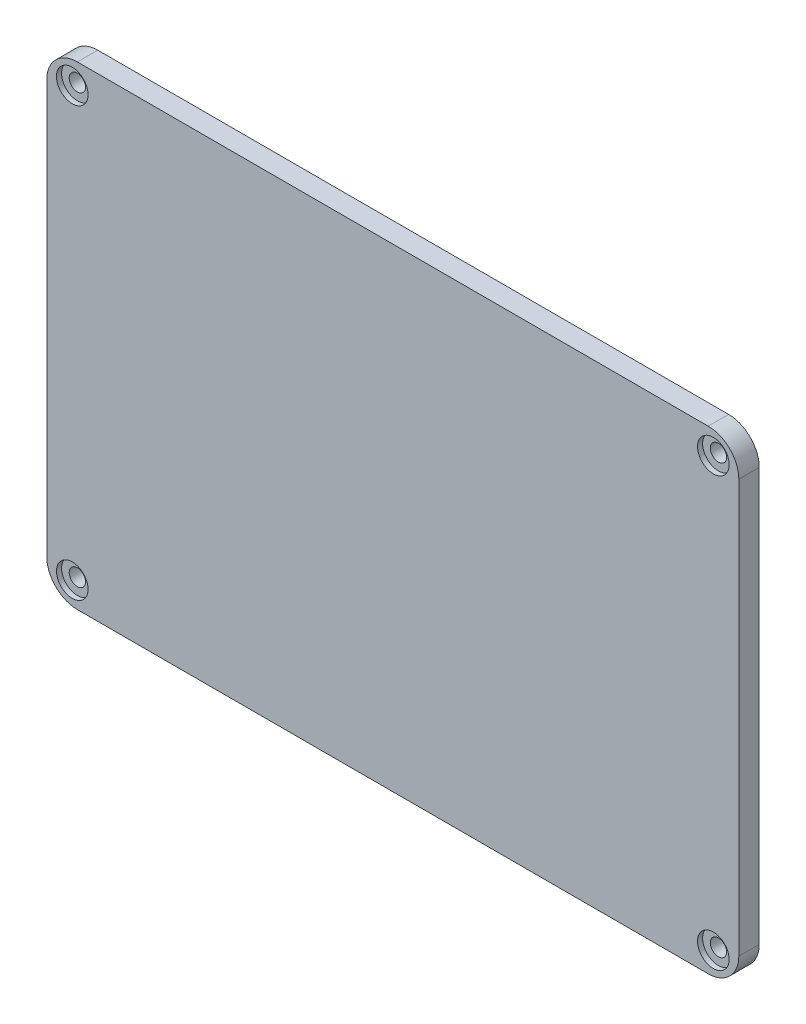
ISO-10303-21;
HEADER;
FILE_DESCRIPTION(('STEP AP214'),'2;1');
FILE_NAME('part.step','',(''),(''),'','','');
FILE_SCHEMA(('AUTOMOTIVE_DESIGN { 1 0 10303 214 1 1 1 1 }'));
ENDSEC;
DATA;
#1=APPLICATION_CONTEXT('core data for automotive mechanical design processes');
#2=APPLICATION_PROTOCOL_DEFINITION('international standard','automotive_design',2000,#1);
#3=PRODUCT_CONTEXT('',#1,'mechanical');
#4=PRODUCT('Part','Part','',(#3));
#5=PRODUCT_RELATED_PRODUCT_CATEGORY('part','',(#4));
#6=PRODUCT_DEFINITION_FORMATION('','',#4);
#7=PRODUCT_DEFINITION_CONTEXT('part definition',#1,'design');
#8=PRODUCT_DEFINITION('design','',#6,#7);
#9=PRODUCT_DEFINITION_SHAPE('','',#8);
#10=(LENGTH_UNIT() NAMED_UNIT(*) SI_UNIT(.MILLI.,.METRE.));
#11=(NAMED_UNIT(*) PLANE_ANGLE_UNIT() SI_UNIT($,.RADIAN.));
#12=(NAMED_UNIT(*) SI_UNIT($,.STERADIAN.) SOLID_ANGLE_UNIT());
#13=UNCERTAINTY_MEASURE_WITH_UNIT(LENGTH_MEASURE(1.E-05),#10,'distance_accuracy_value','');
#14=(GEOMETRIC_REPRESENTATION_CONTEXT(3) GLOBAL_UNCERTAINTY_ASSIGNED_CONTEXT((#13)) GLOBAL_UNIT_ASSIGNED_CONTEXT((#10,
#11,#12)) REPRESENTATION_CONTEXT('',''));
#15=CARTESIAN_POINT('',(0.,0.,0.));
#16=DIRECTION('',(0.,0.,1.));
#17=DIRECTION('',(1.,0.,0.));
#18=AXIS2_PLACEMENT_3D('',#15,#16,#17);
#19=CARTESIAN_POINT('',(-7.20437517782034,-58.6101542455461,4.));
#20=DIRECTION('',(0.,0.,-1.));
#21=DIRECTION('',(-1.,0.,0.));
#22=AXIS2_PLACEMENT_3D('',#19,#20,#21);
#23=CYLINDRICAL_SURFACE('',#22,1.59999999999999);
#24=CARTESIAN_POINT('',(-7.20437517782034,-58.6101542455461,0.));
#25=DIRECTION('',(0.,0.,1.));
#26=DIRECTION('',(1.,0.,0.));
#27=AXIS2_PLACEMENT_3D('',#24,#25,#26);
#28=CIRCLE('',#27,1.59999999999999);
#29=CARTESIAN_POINT('',(-5.60437517782034,-58.6101542455461,0.));
#30=VERTEX_POINT('',#29);
#31=EDGE_CURVE('E136',#30,#30,#28,.T.);
#32=ORIENTED_EDGE('',*,*,#31,.F.);
#33=EDGE_LOOP('',(#32));
#34=FACE_BOUND('',#33,.T.);
#35=CARTESIAN_POINT('',(-7.20437517782034,-58.6101542455461,3.));
#36=DIRECTION('',(0.,0.,1.));
#37=DIRECTION('',(1.,0.,0.));
#38=AXIS2_PLACEMENT_3D('',#35,#36,#37);
#39=CIRCLE('',#38,1.59999999999999);
#40=CARTESIAN_POINT('',(-5.60437517782034,-58.6101542455461,3.));
#41=VERTEX_POINT('',#40);
#42=EDGE_CURVE('E37',#41,#41,#39,.T.);
#43=ORIENTED_EDGE('',*,*,#42,.T.);
#44=EDGE_LOOP('',(#43));
#45=FACE_BOUND('',#44,.T.);
#46=ADVANCED_FACE('F33',(#34,#45),#23,.F.);
#47=CARTESIAN_POINT('',(118.49562482218,-142.610154245546,4.));
#48=DIRECTION('',(0.,0.,-1.));
#49=DIRECTION('',(-1.,0.,0.));
#50=AXIS2_PLACEMENT_3D('',#47,#48,#49);
#51=CYLINDRICAL_SURFACE('',#50,1.6);
#52=CARTESIAN_POINT('',(118.49562482218,-142.610154245546,0.));
#53=DIRECTION('',(0.,0.,1.));
#54=DIRECTION('',(1.,0.,0.));
#55=AXIS2_PLACEMENT_3D('',#52,#53,#54);
#56=CIRCLE('',#55,1.6);
#57=CARTESIAN_POINT('',(120.09562482218,-142.610154245546,0.));
#58=VERTEX_POINT('',#57);
#59=EDGE_CURVE('E174',#58,#58,#56,.T.);
#60=ORIENTED_EDGE('',*,*,#59,.F.);
#61=EDGE_LOOP('',(#60));
#62=FACE_BOUND('',#61,.T.);
#63=CARTESIAN_POINT('',(118.49562482218,-142.610154245546,3.));
#64=DIRECTION('',(0.,0.,1.));
#65=DIRECTION('',(1.,0.,0.));
#66=AXIS2_PLACEMENT_3D('',#63,#64,#65);
#67=CIRCLE('',#66,1.6);
#68=CARTESIAN_POINT('',(120.09562482218,-142.610154245546,3.));
#69=VERTEX_POINT('',#68);
#70=EDGE_CURVE('E162',#69,#69,#67,.T.);
#71=ORIENTED_EDGE('',*,*,#70,.T.);
#72=EDGE_LOOP('',(#71));
#73=FACE_BOUND('',#72,.T.);
#74=ADVANCED_FACE('F226',(#62,#73),#51,.F.);
#75=CARTESIAN_POINT('',(-6.20437517782034,-60.1101542455461,4.));
#76=DIRECTION('',(0.,0.,1.));
#77=DIRECTION('',(1.,0.,0.));
#78=AXIS2_PLACEMENT_3D('',#75,#76,#77);
#79=PLANE('',#78);
#80=CARTESIAN_POINT('',(-7.20437517782034,-142.610154245546,4.));
#81=DIRECTION('',(0.,0.,1.));
#82=DIRECTION('',(-1.,0.,0.));
#83=AXIS2_PLACEMENT_3D('',#80,#81,#82);
#84=CIRCLE('',#83,3.1);
#85=CARTESIAN_POINT('',(-10.3043751778203,-142.610154245546,4.));
#86=VERTEX_POINT('',#85);
#87=EDGE_CURVE('E391',#86,#86,#84,.T.);
#88=ORIENTED_EDGE('',*,*,#87,.F.);
#89=EDGE_LOOP('',(#88));
#90=FACE_BOUND('',#89,.T.);
#91=CARTESIAN_POINT('',(118.49562482218,-142.610154245546,4.));
#92=DIRECTION('',(0.,0.,1.));
#93=DIRECTION('',(1.,0.,0.));
#94=AXIS2_PLACEMENT_3D('',#91,#92,#93);
#95=CIRCLE('',#94,3.10000000000001);
#96=CARTESIAN_POINT('',(121.59562482218,-142.610154245546,4.));
#97=VERTEX_POINT('',#96);
#98=EDGE_CURVE('E397',#97,#97,#95,.T.);
#99=ORIENTED_EDGE('',*,*,#98,.F.);
#100=EDGE_LOOP('',(#99));
#101=FACE_BOUND('',#100,.T.);
#102=CARTESIAN_POINT('',(118.49562482218,-58.610154245546,4.));
#103=DIRECTION('',(0.,0.,1.));
#104=DIRECTION('',(-1.,0.,0.));
#105=AXIS2_PLACEMENT_3D('',#102,#103,#104);
#106=CIRCLE('',#105,3.10000000000002);
#107=CARTESIAN_POINT('',(115.39562482218,-58.610154245546,4.));
#108=VERTEX_POINT('',#107);
#109=EDGE_CURVE('E403',#108,#108,#106,.T.);
#110=ORIENTED_EDGE('',*,*,#109,.F.);
#111=EDGE_LOOP('',(#110));
#112=FACE_BOUND('',#111,.T.);
#113=CARTESIAN_POINT('',(-7.20437517782034,-58.6101542455461,4.));
#114=DIRECTION('',(0.,0.,1.));
#115=DIRECTION('',(1.,0.,0.));
#116=AXIS2_PLACEMENT_3D('',#113,#114,#115);
#117=CIRCLE('',#116,3.1);
#118=CARTESIAN_POINT('',(-4.10437517782034,-58.6101542455461,4.));
#119=VERTEX_POINT('',#118);
#120=EDGE_CURVE('E182',#119,#119,#117,.T.);
#121=ORIENTED_EDGE('',*,*,#120,.F.);
#122=EDGE_LOOP('',(#121));
#123=FACE_BOUND('',#122,.T.);
#124=CARTESIAN_POINT('',(-6.20437517782034,-60.1101542455461,4.));
#125=DIRECTION('',(0.,0.,1.));
#126=DIRECTION('',(1.,0.,0.));
#127=AXIS2_PLACEMENT_3D('',#124,#125,#126);
#128=CIRCLE('',#127,6.);
#129=CARTESIAN_POINT('',(-6.20437517782034,-54.1101542455461,4.));
#130=VERTEX_POINT('',#129);
#131=CARTESIAN_POINT('',(-12.2043751778203,-60.1101542455461,4.));
#132=VERTEX_POINT('',#131);
#133=EDGE_CURVE('E147',#130,#132,#128,.T.);
#134=ORIENTED_EDGE('',*,*,#133,.T.);
#135=DIRECTION('',(0.,-1.,0.));
#136=VECTOR('',#135,1.);
#137=CARTESIAN_POINT('',(-12.2043751778203,-60.1101542455461,4.));
#138=LINE('',#137,#136);
#139=CARTESIAN_POINT('',(-12.2043751778203,-141.110154245546,4.));
#140=VERTEX_POINT('',#139);
#141=EDGE_CURVE('E95',#132,#140,#138,.T.);
#142=ORIENTED_EDGE('',*,*,#141,.T.);
#143=CARTESIAN_POINT('',(-6.20437517782034,-141.110154245546,4.));
#144=DIRECTION('',(0.,0.,1.));
#145=DIRECTION('',(1.,0.,0.));
#146=AXIS2_PLACEMENT_3D('',#143,#144,#145);
#147=CIRCLE('',#146,6.);
#148=CARTESIAN_POINT('',(-6.20437517782034,-147.110154245546,4.));
#149=VERTEX_POINT('',#148);
#150=EDGE_CURVE('E191',#140,#149,#147,.T.);
#151=ORIENTED_EDGE('',*,*,#150,.T.);
#152=DIRECTION('',(1.,0.,0.));
#153=VECTOR('',#152,1.);
#154=CARTESIAN_POINT('',(-6.20437517782034,-147.110154245546,4.));
#155=LINE('',#154,#153);
#156=CARTESIAN_POINT('',(117.49562482218,-147.110154245546,4.));
#157=VERTEX_POINT('',#156);
#158=EDGE_CURVE('E193',#149,#157,#155,.T.);
#159=ORIENTED_EDGE('',*,*,#158,.T.);
#160=CARTESIAN_POINT('',(117.49562482218,-141.110154245546,4.));
#161=DIRECTION('',(0.,0.,1.));
#162=DIRECTION('',(1.,0.,0.));
#163=AXIS2_PLACEMENT_3D('',#160,#161,#162);
#164=CIRCLE('',#163,6.00000000000001);
#165=CARTESIAN_POINT('',(123.49562482218,-141.110154245546,4.));
#166=VERTEX_POINT('',#165);
#167=EDGE_CURVE('E114',#157,#166,#164,.T.);
#168=ORIENTED_EDGE('',*,*,#167,.T.);
#169=DIRECTION('',(0.,1.,0.));
#170=VECTOR('',#169,1.);
#171=CARTESIAN_POINT('',(123.49562482218,-141.110154245546,4.));
#172=LINE('',#171,#170);
#173=CARTESIAN_POINT('',(123.49562482218,-60.1101542455461,4.));
#174=VERTEX_POINT('',#173);
#175=EDGE_CURVE('E108',#166,#174,#172,.T.);
#176=ORIENTED_EDGE('',*,*,#175,.T.);
#177=CARTESIAN_POINT('',(117.49562482218,-60.1101542455461,4.));
#178=DIRECTION('',(0.,0.,1.));
#179=DIRECTION('',(1.,0.,0.));
#180=AXIS2_PLACEMENT_3D('',#177,#178,#179);
#181=CIRCLE('',#180,6.00000000000001);
#182=CARTESIAN_POINT('',(117.49562482218,-54.1101542455461,4.));
#183=VERTEX_POINT('',#182);
#184=EDGE_CURVE('E112',#174,#183,#181,.T.);
#185=ORIENTED_EDGE('',*,*,#184,.T.);
#186=DIRECTION('',(-1.,0.,0.));
#187=VECTOR('',#186,1.);
#188=CARTESIAN_POINT('',(117.49562482218,-54.1101542455461,4.));
#189=LINE('',#188,#187);
#190=EDGE_CURVE('E52',#183,#130,#189,.T.);
#191=ORIENTED_EDGE('',*,*,#190,.T.);
#192=EDGE_LOOP('',(#134,#142,#151,#159,#168,#176,#185,#191));
#193=FACE_BOUND('',#192,.T.);
#194=ADVANCED_FACE('F110',(#90,#101,#112,#123,#193),#79,.T.);
#195=CARTESIAN_POINT('',(-6.20437517782034,-60.1101542455461,0.));
#196=DIRECTION('',(0.,0.,1.));
#197=DIRECTION('',(1.,0.,0.));
#198=AXIS2_PLACEMENT_3D('',#195,#196,#197);
#199=PLANE('',#198);
#200=CARTESIAN_POINT('',(-6.20437517782034,-60.1101542455461,0.));
#201=DIRECTION('',(0.,0.,1.));
#202=DIRECTION('',(1.,0.,0.));
#203=AXIS2_PLACEMENT_3D('',#200,#201,#202);
#204=CIRCLE('',#203,6.);
#205=CARTESIAN_POINT('',(-6.20437517782034,-54.1101542455461,0.));
#206=VERTEX_POINT('',#205);
#207=CARTESIAN_POINT('',(-12.2043751778203,-60.1101542455461,0.));
#208=VERTEX_POINT('',#207);
#209=EDGE_CURVE('E132',#206,#208,#204,.T.);
#210=ORIENTED_EDGE('',*,*,#209,.F.);
#211=DIRECTION('',(-1.,0.,0.));
#212=VECTOR('',#211,1.);
#213=CARTESIAN_POINT('',(117.49562482218,-54.1101542455461,0.));
#214=LINE('',#213,#212);
#215=CARTESIAN_POINT('',(117.49562482218,-54.1101542455461,0.));
#216=VERTEX_POINT('',#215);
#217=EDGE_CURVE('E87',#216,#206,#214,.T.);
#218=ORIENTED_EDGE('',*,*,#217,.F.);
#219=CARTESIAN_POINT('',(117.49562482218,-60.1101542455461,0.));
#220=DIRECTION('',(0.,0.,1.));
#221=DIRECTION('',(1.,0.,0.));
#222=AXIS2_PLACEMENT_3D('',#219,#220,#221);
#223=CIRCLE('',#222,6.00000000000001);
#224=CARTESIAN_POINT('',(123.49562482218,-60.1101542455461,0.));
#225=VERTEX_POINT('',#224);
#226=EDGE_CURVE('E81',#225,#216,#223,.T.);
#227=ORIENTED_EDGE('',*,*,#226,.F.);
#228=DIRECTION('',(0.,1.,0.));
#229=VECTOR('',#228,1.);
#230=CARTESIAN_POINT('',(123.49562482218,-141.110154245546,0.));
#231=LINE('',#230,#229);
#232=CARTESIAN_POINT('',(123.49562482218,-141.110154245546,0.));
#233=VERTEX_POINT('',#232);
#234=EDGE_CURVE('E122',#233,#225,#231,.T.);
#235=ORIENTED_EDGE('',*,*,#234,.F.);
#236=CARTESIAN_POINT('',(117.49562482218,-141.110154245546,0.));
#237=DIRECTION('',(0.,0.,1.));
#238=DIRECTION('',(1.,0.,0.));
#239=AXIS2_PLACEMENT_3D('',#236,#237,#238);
#240=CIRCLE('',#239,6.00000000000001);
#241=CARTESIAN_POINT('',(117.49562482218,-147.110154245546,0.));
#242=VERTEX_POINT('',#241);
#243=EDGE_CURVE('E142',#242,#233,#240,.T.);
#244=ORIENTED_EDGE('',*,*,#243,.F.);
#245=DIRECTION('',(1.,0.,0.));
#246=VECTOR('',#245,1.);
#247=CARTESIAN_POINT('',(-6.20437517782034,-147.110154245546,0.));
#248=LINE('',#247,#246);
#249=CARTESIAN_POINT('',(-6.20437517782034,-147.110154245546,0.));
#250=VERTEX_POINT('',#249);
#251=EDGE_CURVE('E140',#250,#242,#248,.T.);
#252=ORIENTED_EDGE('',*,*,#251,.F.);
#253=CARTESIAN_POINT('',(-6.20437517782034,-141.110154245546,0.));
#254=DIRECTION('',(0.,0.,1.));
#255=DIRECTION('',(1.,0.,0.));
#256=AXIS2_PLACEMENT_3D('',#253,#254,#255);
#257=CIRCLE('',#256,6.);
#258=CARTESIAN_POINT('',(-12.2043751778203,-141.110154245546,0.));
#259=VERTEX_POINT('',#258);
#260=EDGE_CURVE('E138',#259,#250,#257,.T.);
#261=ORIENTED_EDGE('',*,*,#260,.F.);
#262=DIRECTION('',(0.,-1.,0.));
#263=VECTOR('',#262,1.);
#264=CARTESIAN_POINT('',(-12.2043751778203,-60.1101542455461,0.));
#265=LINE('',#264,#263);
#266=EDGE_CURVE('E135',#208,#259,#265,.T.);
#267=ORIENTED_EDGE('',*,*,#266,.F.);
#268=EDGE_LOOP('',(#210,#218,#227,#235,#244,#252,#261,#267));
#269=FACE_BOUND('',#268,.T.);
#270=ORIENTED_EDGE('',*,*,#31,.T.);
#271=EDGE_LOOP('',(#270));
#272=FACE_BOUND('',#271,.T.);
#273=CARTESIAN_POINT('',(118.49562482218,-58.610154245546,0.));
#274=DIRECTION('',(0.,0.,1.));
#275=DIRECTION('',(1.,0.,0.));
#276=AXIS2_PLACEMENT_3D('',#273,#274,#275);
#277=CIRCLE('',#276,1.60000000000001);
#278=CARTESIAN_POINT('',(120.09562482218,-58.610154245546,0.));
#279=VERTEX_POINT('',#278);
#280=EDGE_CURVE('E179',#279,#279,#277,.T.);
#281=ORIENTED_EDGE('',*,*,#280,.T.);
#282=EDGE_LOOP('',(#281));
#283=FACE_BOUND('',#282,.T.);
#284=ORIENTED_EDGE('',*,*,#59,.T.);
#285=EDGE_LOOP('',(#284));
#286=FACE_BOUND('',#285,.T.);
#287=CARTESIAN_POINT('',(-7.20437517782032,-142.610154245546,0.));
#288=DIRECTION('',(0.,0.,1.));
#289=DIRECTION('',(1.,0.,0.));
#290=AXIS2_PLACEMENT_3D('',#287,#288,#289);
#291=CIRCLE('',#290,1.59999999999999);
#292=CARTESIAN_POINT('',(-5.60437517782033,-142.610154245546,0.));
#293=VERTEX_POINT('',#292);
#294=EDGE_CURVE('E170',#293,#293,#291,.T.);
#295=ORIENTED_EDGE('',*,*,#294,.T.);
#296=EDGE_LOOP('',(#295));
#297=FACE_BOUND('',#296,.T.);
#298=ADVANCED_FACE('F206',(#269,#272,#283,#286,#297),#199,.F.);
#299=CARTESIAN_POINT('',(-6.20437517782034,-60.1101542455461,4.));
#300=DIRECTION('',(0.,0.,-1.));
#301=DIRECTION('',(-1.,0.,0.));
#302=AXIS2_PLACEMENT_3D('',#299,#300,#301);
#303=CYLINDRICAL_SURFACE('',#302,6.);
#304=ORIENTED_EDGE('',*,*,#209,.T.);
#305=DIRECTION('',(0.,0.,-1.));
#306=VECTOR('',#305,1.);
#307=CARTESIAN_POINT('',(-12.2043751778203,-60.1101542455461,4.));
#308=LINE('',#307,#306);
#309=EDGE_CURVE('E11',#132,#208,#308,.T.);
#310=ORIENTED_EDGE('',*,*,#309,.F.);
#311=ORIENTED_EDGE('',*,*,#133,.F.);
#312=DIRECTION('',(0.,0.,-1.));
#313=VECTOR('',#312,1.);
#314=CARTESIAN_POINT('',(-6.20437517782034,-54.1101542455461,4.));
#315=LINE('',#314,#313);
#316=EDGE_CURVE('E128',#130,#206,#315,.T.);
#317=ORIENTED_EDGE('',*,*,#316,.T.);
#318=EDGE_LOOP('',(#304,#310,#311,#317));
#319=FACE_BOUND('',#318,.T.);
#320=ADVANCED_FACE('F35',(#319),#303,.T.);
#321=CARTESIAN_POINT('',(-12.2043751778203,-60.1101542455461,4.));
#322=DIRECTION('',(1.,0.,0.));
#323=DIRECTION('',(0.,1.,0.));
#324=AXIS2_PLACEMENT_3D('',#321,#322,#323);
#325=PLANE('',#324);
#326=ORIENTED_EDGE('',*,*,#266,.T.);
#327=DIRECTION('',(0.,0.,-1.));
#328=VECTOR('',#327,1.);
#329=CARTESIAN_POINT('',(-12.2043751778203,-141.110154245546,4.));
#330=LINE('',#329,#328);
#331=EDGE_CURVE('E43',#140,#259,#330,.T.);
#332=ORIENTED_EDGE('',*,*,#331,.F.);
#333=ORIENTED_EDGE('',*,*,#141,.F.);
#334=ORIENTED_EDGE('',*,*,#309,.T.);
#335=EDGE_LOOP('',(#326,#332,#333,#334));
#336=FACE_BOUND('',#335,.T.);
#337=ADVANCED_FACE('F242',(#336),#325,.F.);
#338=CARTESIAN_POINT('',(-6.20437517782034,-141.110154245546,4.));
#339=DIRECTION('',(0.,0.,-1.));
#340=DIRECTION('',(-1.,0.,0.));
#341=AXIS2_PLACEMENT_3D('',#338,#339,#340);
#342=CYLINDRICAL_SURFACE('',#341,6.);
#343=ORIENTED_EDGE('',*,*,#260,.T.);
#344=DIRECTION('',(0.,0.,-1.));
#345=VECTOR('',#344,1.);
#346=CARTESIAN_POINT('',(-6.20437517782034,-147.110154245546,4.));
#347=LINE('',#346,#345);
#348=EDGE_CURVE('E154',#149,#250,#347,.T.);
#349=ORIENTED_EDGE('',*,*,#348,.F.);
#350=ORIENTED_EDGE('',*,*,#150,.F.);
#351=ORIENTED_EDGE('',*,*,#331,.T.);
#352=EDGE_LOOP('',(#343,#349,#350,#351));
#353=FACE_BOUND('',#352,.T.);
#354=ADVANCED_FACE('F246',(#353),#342,.T.);
#355=CARTESIAN_POINT('',(-6.20437517782034,-147.110154245546,4.));
#356=DIRECTION('',(0.,1.,0.));
#357=DIRECTION('',(0.,0.,1.));
#358=AXIS2_PLACEMENT_3D('',#355,#356,#357);
#359=PLANE('',#358);
#360=ORIENTED_EDGE('',*,*,#251,.T.);
#361=DIRECTION('',(0.,0.,-1.));
#362=VECTOR('',#361,1.);
#363=CARTESIAN_POINT('',(117.49562482218,-147.110154245546,4.));
#364=LINE('',#363,#362);
#365=EDGE_CURVE('E151',#157,#242,#364,.T.);
#366=ORIENTED_EDGE('',*,*,#365,.F.);
#367=ORIENTED_EDGE('',*,*,#158,.F.);
#368=ORIENTED_EDGE('',*,*,#348,.T.);
#369=EDGE_LOOP('',(#360,#366,#367,#368));
#370=FACE_BOUND('',#369,.T.);
#371=ADVANCED_FACE('F199',(#370),#359,.F.);
#372=CARTESIAN_POINT('',(117.49562482218,-141.110154245546,4.));
#373=DIRECTION('',(0.,0.,-1.));
#374=DIRECTION('',(-1.,0.,0.));
#375=AXIS2_PLACEMENT_3D('',#372,#373,#374);
#376=CYLINDRICAL_SURFACE('',#375,6.00000000000001);
#377=ORIENTED_EDGE('',*,*,#243,.T.);
#378=DIRECTION('',(0.,0.,-1.));
#379=VECTOR('',#378,1.);
#380=CARTESIAN_POINT('',(123.49562482218,-141.110154245546,4.));
#381=LINE('',#380,#379);
#382=EDGE_CURVE('E123',#166,#233,#381,.T.);
#383=ORIENTED_EDGE('',*,*,#382,.F.);
#384=ORIENTED_EDGE('',*,*,#167,.F.);
#385=ORIENTED_EDGE('',*,*,#365,.T.);
#386=EDGE_LOOP('',(#377,#383,#384,#385));
#387=FACE_BOUND('',#386,.T.);
#388=ADVANCED_FACE('F203',(#387),#376,.T.);
#389=CARTESIAN_POINT('',(123.49562482218,-141.110154245546,4.));
#390=DIRECTION('',(-1.,0.,0.));
#391=DIRECTION('',(0.,0.,1.));
#392=AXIS2_PLACEMENT_3D('',#389,#390,#391);
#393=PLANE('',#392);
#394=ORIENTED_EDGE('',*,*,#234,.T.);
#395=DIRECTION('',(0.,0.,-1.));
#396=VECTOR('',#395,1.);
#397=CARTESIAN_POINT('',(123.49562482218,-60.1101542455461,4.));
#398=LINE('',#397,#396);
#399=EDGE_CURVE('E119',#174,#225,#398,.T.);
#400=ORIENTED_EDGE('',*,*,#399,.F.);
#401=ORIENTED_EDGE('',*,*,#175,.F.);
#402=ORIENTED_EDGE('',*,*,#382,.T.);
#403=EDGE_LOOP('',(#394,#400,#401,#402));
#404=FACE_BOUND('',#403,.T.);
#405=ADVANCED_FACE('F120',(#404),#393,.F.);
#406=CARTESIAN_POINT('',(117.49562482218,-60.1101542455461,4.));
#407=DIRECTION('',(0.,0.,-1.));
#408=DIRECTION('',(-1.,0.,0.));
#409=AXIS2_PLACEMENT_3D('',#406,#407,#408);
#410=CYLINDRICAL_SURFACE('',#409,6.00000000000001);
#411=ORIENTED_EDGE('',*,*,#226,.T.);
#412=DIRECTION('',(0.,0.,-1.));
#413=VECTOR('',#412,1.);
#414=CARTESIAN_POINT('',(117.49562482218,-54.1101542455461,4.));
#415=LINE('',#414,#413);
#416=EDGE_CURVE('E124',#183,#216,#415,.T.);
#417=ORIENTED_EDGE('',*,*,#416,.F.);
#418=ORIENTED_EDGE('',*,*,#184,.F.);
#419=ORIENTED_EDGE('',*,*,#399,.T.);
#420=EDGE_LOOP('',(#411,#417,#418,#419));
#421=FACE_BOUND('',#420,.T.);
#422=ADVANCED_FACE('F126',(#421),#410,.T.);
#423=CARTESIAN_POINT('',(117.49562482218,-54.1101542455461,4.));
#424=DIRECTION('',(0.,-1.,0.));
#425=DIRECTION('',(0.,0.,-1.));
#426=AXIS2_PLACEMENT_3D('',#423,#424,#425);
#427=PLANE('',#426);
#428=ORIENTED_EDGE('',*,*,#217,.T.);
#429=ORIENTED_EDGE('',*,*,#316,.F.);
#430=ORIENTED_EDGE('',*,*,#190,.F.);
#431=ORIENTED_EDGE('',*,*,#416,.T.);
#432=EDGE_LOOP('',(#428,#429,#430,#431));
#433=FACE_BOUND('',#432,.T.);
#434=ADVANCED_FACE('F212',(#433),#427,.F.);
#435=CARTESIAN_POINT('',(118.49562482218,-58.610154245546,4.));
#436=DIRECTION('',(0.,0.,-1.));
#437=DIRECTION('',(-1.,0.,0.));
#438=AXIS2_PLACEMENT_3D('',#435,#436,#437);
#439=CYLINDRICAL_SURFACE('',#438,1.60000000000001);
#440=CARTESIAN_POINT('',(118.49562482218,-58.610154245546,3.));
#441=DIRECTION('',(0.,0.,-1.));
#442=DIRECTION('',(-1.,0.,0.));
#443=AXIS2_PLACEMENT_3D('',#440,#441,#442);
#444=CIRCLE('',#443,1.60000000000001);
#445=CARTESIAN_POINT('',(116.89562482218,-58.610154245546,3.));
#446=VERTEX_POINT('',#445);
#447=EDGE_CURVE('E165',#446,#446,#444,.T.);
#448=ORIENTED_EDGE('',*,*,#447,.F.);
#449=EDGE_LOOP('',(#448));
#450=FACE_BOUND('',#449,.T.);
#451=ORIENTED_EDGE('',*,*,#280,.F.);
#452=EDGE_LOOP('',(#451));
#453=FACE_BOUND('',#452,.T.);
#454=ADVANCED_FACE('F214',(#450,#453),#439,.F.);
#455=CARTESIAN_POINT('',(-7.20437517782032,-142.610154245546,4.));
#456=DIRECTION('',(0.,0.,-1.));
#457=DIRECTION('',(-1.,0.,0.));
#458=AXIS2_PLACEMENT_3D('',#455,#456,#457);
#459=CYLINDRICAL_SURFACE('',#458,1.59999999999999);
#460=CARTESIAN_POINT('',(-7.20437517782032,-142.610154245546,3.));
#461=DIRECTION('',(0.,0.,-1.));
#462=DIRECTION('',(-1.,0.,0.));
#463=AXIS2_PLACEMENT_3D('',#460,#461,#462);
#464=CIRCLE('',#463,1.59999999999999);
#465=CARTESIAN_POINT('',(-8.80437517782031,-142.610154245546,3.));
#466=VERTEX_POINT('',#465);
#467=EDGE_CURVE('E159',#466,#466,#464,.T.);
#468=ORIENTED_EDGE('',*,*,#467,.F.);
#469=EDGE_LOOP('',(#468));
#470=FACE_BOUND('',#469,.T.);
#471=ORIENTED_EDGE('',*,*,#294,.F.);
#472=EDGE_LOOP('',(#471));
#473=FACE_BOUND('',#472,.T.);
#474=ADVANCED_FACE('F220',(#470,#473),#459,.F.);
#475=CARTESIAN_POINT('',(-7.20437517782034,-142.610154245546,3.));
#476=DIRECTION('',(0.,0.,1.));
#477=DIRECTION('',(1.,0.,0.));
#478=AXIS2_PLACEMENT_3D('',#475,#476,#477);
#479=CYLINDRICAL_SURFACE('',#478,3.1);
#480=CARTESIAN_POINT('',(-7.20437517782034,-142.610154245546,3.));
#481=DIRECTION('',(0.,0.,1.));
#482=DIRECTION('',(-1.,0.,0.));
#483=AXIS2_PLACEMENT_3D('',#480,#481,#482);
#484=CIRCLE('',#483,3.1);
#485=CARTESIAN_POINT('',(-10.3043751778203,-142.610154245546,3.));
#486=VERTEX_POINT('',#485);
#487=EDGE_CURVE('E394',#486,#486,#484,.T.);
#488=ORIENTED_EDGE('',*,*,#487,.F.);
#489=EDGE_LOOP('',(#488));
#490=FACE_BOUND('',#489,.T.);
#491=ORIENTED_EDGE('',*,*,#87,.T.);
#492=EDGE_LOOP('',(#491));
#493=FACE_BOUND('',#492,.T.);
#494=ADVANCED_FACE('F303',(#490,#493),#479,.F.);
#495=CARTESIAN_POINT('',(-7.20437517782034,-142.610154245546,3.));
#496=DIRECTION('',(0.,0.,-1.));
#497=DIRECTION('',(-1.,0.,0.));
#498=AXIS2_PLACEMENT_3D('',#495,#496,#497);
#499=PLANE('',#498);
#500=ORIENTED_EDGE('',*,*,#467,.T.);
#501=EDGE_LOOP('',(#500));
#502=FACE_BOUND('',#501,.T.);
#503=ORIENTED_EDGE('',*,*,#487,.T.);
#504=EDGE_LOOP('',(#503));
#505=FACE_BOUND('',#504,.T.);
#506=ADVANCED_FACE('F312',(#502,#505),#499,.F.);
#507=CARTESIAN_POINT('',(118.49562482218,-142.610154245546,3.));
#508=DIRECTION('',(0.,0.,1.));
#509=DIRECTION('',(1.,0.,0.));
#510=AXIS2_PLACEMENT_3D('',#507,#508,#509);
#511=CYLINDRICAL_SURFACE('',#510,3.10000000000001);
#512=CARTESIAN_POINT('',(118.49562482218,-142.610154245546,3.));
#513=DIRECTION('',(0.,0.,1.));
#514=DIRECTION('',(1.,0.,0.));
#515=AXIS2_PLACEMENT_3D('',#512,#513,#514);
#516=CIRCLE('',#515,3.10000000000001);
#517=CARTESIAN_POINT('',(121.59562482218,-142.610154245546,3.));
#518=VERTEX_POINT('',#517);
#519=EDGE_CURVE('E400',#518,#518,#516,.T.);
#520=ORIENTED_EDGE('',*,*,#519,.F.);
#521=EDGE_LOOP('',(#520));
#522=FACE_BOUND('',#521,.T.);
#523=ORIENTED_EDGE('',*,*,#98,.T.);
#524=EDGE_LOOP('',(#523));
#525=FACE_BOUND('',#524,.T.);
#526=ADVANCED_FACE('F322',(#522,#525),#511,.F.);
#527=CARTESIAN_POINT('',(118.49562482218,-142.610154245546,3.));
#528=DIRECTION('',(0.,0.,1.));
#529=DIRECTION('',(1.,0.,0.));
#530=AXIS2_PLACEMENT_3D('',#527,#528,#529);
#531=PLANE('',#530);
#532=ORIENTED_EDGE('',*,*,#70,.F.);
#533=EDGE_LOOP('',(#532));
#534=FACE_BOUND('',#533,.T.);
#535=ORIENTED_EDGE('',*,*,#519,.T.);
#536=EDGE_LOOP('',(#535));
#537=FACE_BOUND('',#536,.T.);
#538=ADVANCED_FACE('F332',(#534,#537),#531,.T.);
#539=CARTESIAN_POINT('',(118.49562482218,-58.610154245546,3.));
#540=DIRECTION('',(0.,0.,1.));
#541=DIRECTION('',(1.,0.,0.));
#542=AXIS2_PLACEMENT_3D('',#539,#540,#541);
#543=CYLINDRICAL_SURFACE('',#542,3.10000000000002);
#544=CARTESIAN_POINT('',(118.49562482218,-58.610154245546,3.));
#545=DIRECTION('',(0.,0.,1.));
#546=DIRECTION('',(-1.,0.,0.));
#547=AXIS2_PLACEMENT_3D('',#544,#545,#546);
#548=CIRCLE('',#547,3.10000000000002);
#549=CARTESIAN_POINT('',(115.39562482218,-58.610154245546,3.));
#550=VERTEX_POINT('',#549);
#551=EDGE_CURVE('E389',#550,#550,#548,.T.);
#552=ORIENTED_EDGE('',*,*,#551,.F.);
#553=EDGE_LOOP('',(#552));
#554=FACE_BOUND('',#553,.T.);
#555=ORIENTED_EDGE('',*,*,#109,.T.);
#556=EDGE_LOOP('',(#555));
#557=FACE_BOUND('',#556,.T.);
#558=ADVANCED_FACE('F342',(#554,#557),#543,.F.);
#559=CARTESIAN_POINT('',(118.49562482218,-58.610154245546,3.));
#560=DIRECTION('',(0.,0.,-1.));
#561=DIRECTION('',(-1.,0.,0.));
#562=AXIS2_PLACEMENT_3D('',#559,#560,#561);
#563=PLANE('',#562);
#564=ORIENTED_EDGE('',*,*,#447,.T.);
#565=EDGE_LOOP('',(#564));
#566=FACE_BOUND('',#565,.T.);
#567=ORIENTED_EDGE('',*,*,#551,.T.);
#568=EDGE_LOOP('',(#567));
#569=FACE_BOUND('',#568,.T.);
#570=ADVANCED_FACE('F352',(#566,#569),#563,.F.);
#571=CARTESIAN_POINT('',(-7.20437517782034,-58.6101542455461,3.));
#572=DIRECTION('',(0.,0.,1.));
#573=DIRECTION('',(1.,0.,0.));
#574=AXIS2_PLACEMENT_3D('',#571,#572,#573);
#575=CYLINDRICAL_SURFACE('',#574,3.1);
#576=CARTESIAN_POINT('',(-7.20437517782034,-58.6101542455461,3.));
#577=DIRECTION('',(0.,0.,1.));
#578=DIRECTION('',(1.,0.,0.));
#579=AXIS2_PLACEMENT_3D('',#576,#577,#578);
#580=CIRCLE('',#579,3.1);
#581=CARTESIAN_POINT('',(-4.10437517782034,-58.6101542455461,3.));
#582=VERTEX_POINT('',#581);
#583=EDGE_CURVE('E163',#582,#582,#580,.T.);
#584=ORIENTED_EDGE('',*,*,#583,.F.);
#585=EDGE_LOOP('',(#584));
#586=FACE_BOUND('',#585,.T.);
#587=ORIENTED_EDGE('',*,*,#120,.T.);
#588=EDGE_LOOP('',(#587));
#589=FACE_BOUND('',#588,.T.);
#590=ADVANCED_FACE('F362',(#586,#589),#575,.F.);
#591=CARTESIAN_POINT('',(-7.20437517782034,-58.6101542455461,3.));
#592=DIRECTION('',(0.,0.,1.));
#593=DIRECTION('',(1.,0.,0.));
#594=AXIS2_PLACEMENT_3D('',#591,#592,#593);
#595=PLANE('',#594);
#596=ORIENTED_EDGE('',*,*,#42,.F.);
#597=EDGE_LOOP('',(#596));
#598=FACE_BOUND('',#597,.T.);
#599=ORIENTED_EDGE('',*,*,#583,.T.);
#600=EDGE_LOOP('',(#599));
#601=FACE_BOUND('',#600,.T.);
#602=ADVANCED_FACE('F371',(#598,#601),#595,.T.);
#603=CLOSED_SHELL('',(#46,#74,#194,#298,#320,#337,#354,#371,#388,#405,#422,#434,#454,#474,#494,
#506,#526,#538,#558,#570,#590,#602));
#604=MANIFOLD_SOLID_BREP('B2',#603);
#605=ADVANCED_BREP_SHAPE_REPRESENTATION('',(#18,#604),#14);
#606=SHAPE_DEFINITION_REPRESENTATION(#9,#605);
ENDSEC;
END-ISO-10303-21;
